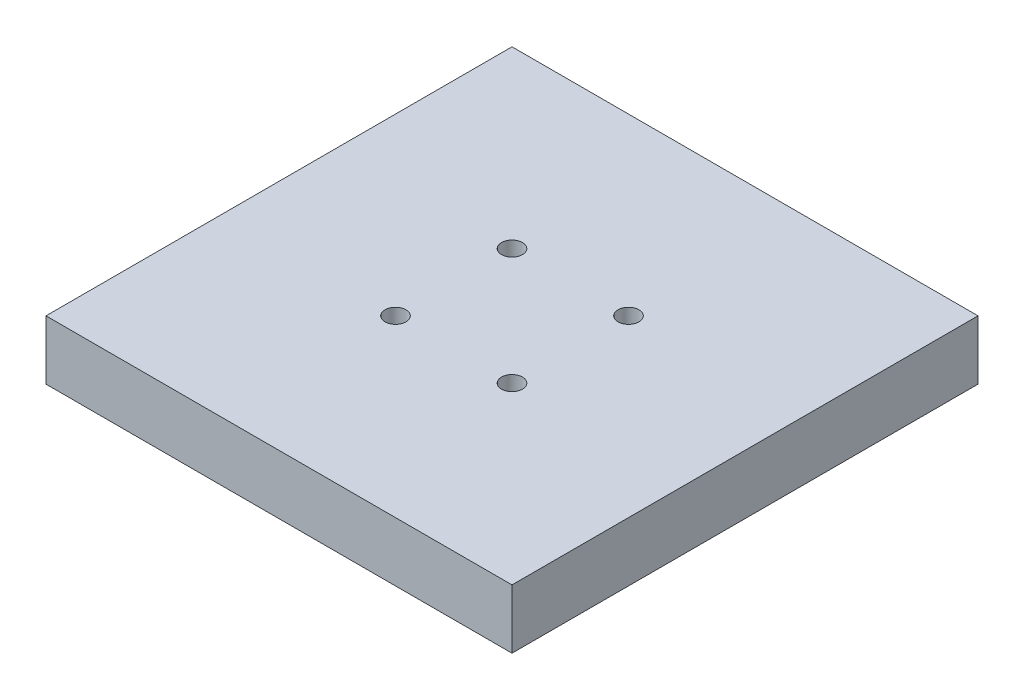
ISO-10303-21;
HEADER;
FILE_DESCRIPTION(('STEP AP214'),'2;1');
FILE_NAME('part.step','',(''),(''),'','','');
FILE_SCHEMA(('AUTOMOTIVE_DESIGN { 1 0 10303 214 1 1 1 1 }'));
ENDSEC;
DATA;
#1=APPLICATION_CONTEXT('core data for automotive mechanical design processes');
#2=APPLICATION_PROTOCOL_DEFINITION('international standard','automotive_design',2000,#1);
#3=PRODUCT_CONTEXT('',#1,'mechanical');
#4=PRODUCT('Part','Part','',(#3));
#5=PRODUCT_RELATED_PRODUCT_CATEGORY('part','',(#4));
#6=PRODUCT_DEFINITION_FORMATION('','',#4);
#7=PRODUCT_DEFINITION_CONTEXT('part definition',#1,'design');
#8=PRODUCT_DEFINITION('design','',#6,#7);
#9=PRODUCT_DEFINITION_SHAPE('','',#8);
#10=(LENGTH_UNIT() NAMED_UNIT(*) SI_UNIT(.MILLI.,.METRE.));
#11=(NAMED_UNIT(*) PLANE_ANGLE_UNIT() SI_UNIT($,.RADIAN.));
#12=(NAMED_UNIT(*) SI_UNIT($,.STERADIAN.) SOLID_ANGLE_UNIT());
#13=UNCERTAINTY_MEASURE_WITH_UNIT(LENGTH_MEASURE(1.E-05),#10,'distance_accuracy_value','');
#14=(GEOMETRIC_REPRESENTATION_CONTEXT(3) GLOBAL_UNCERTAINTY_ASSIGNED_CONTEXT((#13)) GLOBAL_UNIT_ASSIGNED_CONTEXT((#10,
#11,#12)) REPRESENTATION_CONTEXT('',''));
#15=CARTESIAN_POINT('',(0.,0.,0.));
#16=DIRECTION('',(0.,0.,1.));
#17=DIRECTION('',(1.,0.,0.));
#18=AXIS2_PLACEMENT_3D('',#15,#16,#17);
#19=CARTESIAN_POINT('',(-50.,12.7,50.));
#20=DIRECTION('',(1.,0.,0.));
#21=DIRECTION('',(0.,0.,-1.));
#22=AXIS2_PLACEMENT_3D('',#19,#20,#21);
#23=PLANE('',#22);
#24=DIRECTION('',(0.,0.,1.));
#25=VECTOR('',#24,1.);
#26=CARTESIAN_POINT('',(-50.,0.,50.));
#27=LINE('',#26,#25);
#28=CARTESIAN_POINT('',(-50.,0.,-50.));
#29=VERTEX_POINT('',#28);
#30=CARTESIAN_POINT('',(-50.,0.,50.));
#31=VERTEX_POINT('',#30);
#32=EDGE_CURVE('E97',#29,#31,#27,.T.);
#33=ORIENTED_EDGE('',*,*,#32,.T.);
#34=DIRECTION('',(0.,-1.,0.));
#35=VECTOR('',#34,1.);
#36=CARTESIAN_POINT('',(-50.,12.7,50.));
#37=LINE('',#36,#35);
#38=CARTESIAN_POINT('',(-50.,12.7,50.));
#39=VERTEX_POINT('',#38);
#40=EDGE_CURVE('E12',#39,#31,#37,.T.);
#41=ORIENTED_EDGE('',*,*,#40,.F.);
#42=DIRECTION('',(0.,0.,1.));
#43=VECTOR('',#42,1.);
#44=CARTESIAN_POINT('',(-50.,12.7,50.));
#45=LINE('',#44,#43);
#46=CARTESIAN_POINT('',(-50.,12.7,-50.));
#47=VERTEX_POINT('',#46);
#48=EDGE_CURVE('E85',#47,#39,#45,.T.);
#49=ORIENTED_EDGE('',*,*,#48,.F.);
#50=DIRECTION('',(0.,-1.,0.));
#51=VECTOR('',#50,1.);
#52=CARTESIAN_POINT('',(-50.,12.7,-50.));
#53=LINE('',#52,#51);
#54=EDGE_CURVE('E93',#47,#29,#53,.T.);
#55=ORIENTED_EDGE('',*,*,#54,.T.);
#56=EDGE_LOOP('',(#33,#41,#49,#55));
#57=FACE_BOUND('',#56,.T.);
#58=ADVANCED_FACE('F34',(#57),#23,.F.);
#59=CARTESIAN_POINT('',(50.,12.7,50.));
#60=DIRECTION('',(0.,0.,-1.));
#61=DIRECTION('',(-1.,0.,0.));
#62=AXIS2_PLACEMENT_3D('',#59,#60,#61);
#63=PLANE('',#62);
#64=DIRECTION('',(1.,0.,0.));
#65=VECTOR('',#64,1.);
#66=CARTESIAN_POINT('',(50.,0.,50.));
#67=LINE('',#66,#65);
#68=CARTESIAN_POINT('',(50.,0.,50.));
#69=VERTEX_POINT('',#68);
#70=EDGE_CURVE('E89',#31,#69,#67,.T.);
#71=ORIENTED_EDGE('',*,*,#70,.T.);
#72=DIRECTION('',(0.,-1.,0.));
#73=VECTOR('',#72,1.);
#74=CARTESIAN_POINT('',(50.,12.7,50.));
#75=LINE('',#74,#73);
#76=CARTESIAN_POINT('',(50.,12.7,50.));
#77=VERTEX_POINT('',#76);
#78=EDGE_CURVE('E42',#77,#69,#75,.T.);
#79=ORIENTED_EDGE('',*,*,#78,.F.);
#80=DIRECTION('',(1.,0.,0.));
#81=VECTOR('',#80,1.);
#82=CARTESIAN_POINT('',(50.,12.7,50.));
#83=LINE('',#82,#81);
#84=EDGE_CURVE('E80',#39,#77,#83,.T.);
#85=ORIENTED_EDGE('',*,*,#84,.F.);
#86=ORIENTED_EDGE('',*,*,#40,.T.);
#87=EDGE_LOOP('',(#71,#79,#85,#86));
#88=FACE_BOUND('',#87,.T.);
#89=ADVANCED_FACE('F88',(#88),#63,.F.);
#90=CARTESIAN_POINT('',(50.,12.7,50.));
#91=DIRECTION('',(-1.,0.,0.));
#92=DIRECTION('',(0.,0.,1.));
#93=AXIS2_PLACEMENT_3D('',#90,#91,#92);
#94=PLANE('',#93);
#95=DIRECTION('',(0.,0.,-1.));
#96=VECTOR('',#95,1.);
#97=CARTESIAN_POINT('',(50.,0.,50.));
#98=LINE('',#97,#96);
#99=CARTESIAN_POINT('',(50.,0.,-50.));
#100=VERTEX_POINT('',#99);
#101=EDGE_CURVE('E67',#69,#100,#98,.T.);
#102=ORIENTED_EDGE('',*,*,#101,.T.);
#103=DIRECTION('',(0.,-1.,0.));
#104=VECTOR('',#103,1.);
#105=CARTESIAN_POINT('',(50.,12.7,-50.));
#106=LINE('',#105,#104);
#107=CARTESIAN_POINT('',(50.,12.7,-50.));
#108=VERTEX_POINT('',#107);
#109=EDGE_CURVE('E90',#108,#100,#106,.T.);
#110=ORIENTED_EDGE('',*,*,#109,.F.);
#111=DIRECTION('',(0.,0.,-1.));
#112=VECTOR('',#111,1.);
#113=CARTESIAN_POINT('',(50.,12.7,50.));
#114=LINE('',#113,#112);
#115=EDGE_CURVE('E83',#77,#108,#114,.T.);
#116=ORIENTED_EDGE('',*,*,#115,.F.);
#117=ORIENTED_EDGE('',*,*,#78,.T.);
#118=EDGE_LOOP('',(#102,#110,#116,#117));
#119=FACE_BOUND('',#118,.T.);
#120=ADVANCED_FACE('F91',(#119),#94,.F.);
#121=CARTESIAN_POINT('',(50.,12.7,-50.));
#122=DIRECTION('',(0.,0.,1.));
#123=DIRECTION('',(1.,0.,0.));
#124=AXIS2_PLACEMENT_3D('',#121,#122,#123);
#125=PLANE('',#124);
#126=DIRECTION('',(-1.,0.,0.));
#127=VECTOR('',#126,1.);
#128=CARTESIAN_POINT('',(50.,0.,-50.));
#129=LINE('',#128,#127);
#130=EDGE_CURVE('E73',#100,#29,#129,.T.);
#131=ORIENTED_EDGE('',*,*,#130,.T.);
#132=ORIENTED_EDGE('',*,*,#54,.F.);
#133=DIRECTION('',(-1.,0.,0.));
#134=VECTOR('',#133,1.);
#135=CARTESIAN_POINT('',(50.,12.7,-50.));
#136=LINE('',#135,#134);
#137=EDGE_CURVE('E50',#108,#47,#136,.T.);
#138=ORIENTED_EDGE('',*,*,#137,.F.);
#139=ORIENTED_EDGE('',*,*,#109,.T.);
#140=EDGE_LOOP('',(#131,#132,#138,#139));
#141=FACE_BOUND('',#140,.T.);
#142=ADVANCED_FACE('F105',(#141),#125,.F.);
#143=CARTESIAN_POINT('',(0.,12.7,0.));
#144=DIRECTION('',(0.,1.,0.));
#145=DIRECTION('',(0.,0.,1.));
#146=AXIS2_PLACEMENT_3D('',#143,#144,#145);
#147=PLANE('',#146);
#148=CARTESIAN_POINT('',(12.5,12.7,12.5));
#149=DIRECTION('',(0.,-1.,0.));
#150=DIRECTION('',(0.,0.,-1.));
#151=AXIS2_PLACEMENT_3D('',#148,#149,#150);
#152=CIRCLE('',#151,2.25);
#153=CARTESIAN_POINT('',(12.5,12.7,10.25));
#154=VERTEX_POINT('',#153);
#155=EDGE_CURVE('E121',#154,#154,#152,.T.);
#156=ORIENTED_EDGE('',*,*,#155,.T.);
#157=EDGE_LOOP('',(#156));
#158=FACE_BOUND('',#157,.T.);
#159=CARTESIAN_POINT('',(-12.5,12.7,12.5));
#160=DIRECTION('',(0.,-1.,0.));
#161=DIRECTION('',(0.,0.,-1.));
#162=AXIS2_PLACEMENT_3D('',#159,#160,#161);
#163=CIRCLE('',#162,2.25000000000001);
#164=CARTESIAN_POINT('',(-12.5,12.7,10.25));
#165=VERTEX_POINT('',#164);
#166=EDGE_CURVE('E120',#165,#165,#163,.T.);
#167=ORIENTED_EDGE('',*,*,#166,.T.);
#168=EDGE_LOOP('',(#167));
#169=FACE_BOUND('',#168,.T.);
#170=CARTESIAN_POINT('',(12.5,12.7,-12.5));
#171=DIRECTION('',(0.,-1.,0.));
#172=DIRECTION('',(0.,0.,-1.));
#173=AXIS2_PLACEMENT_3D('',#170,#171,#172);
#174=CIRCLE('',#173,2.25);
#175=CARTESIAN_POINT('',(12.5,12.7,-14.75));
#176=VERTEX_POINT('',#175);
#177=EDGE_CURVE('E114',#176,#176,#174,.T.);
#178=ORIENTED_EDGE('',*,*,#177,.T.);
#179=EDGE_LOOP('',(#178));
#180=FACE_BOUND('',#179,.T.);
#181=CARTESIAN_POINT('',(-12.5,12.7,-12.5));
#182=DIRECTION('',(0.,-1.,0.));
#183=DIRECTION('',(0.,0.,-1.));
#184=AXIS2_PLACEMENT_3D('',#181,#182,#183);
#185=CIRCLE('',#184,2.25000000000001);
#186=CARTESIAN_POINT('',(-12.5,12.7,-14.75));
#187=VERTEX_POINT('',#186);
#188=EDGE_CURVE('E100',#187,#187,#185,.T.);
#189=ORIENTED_EDGE('',*,*,#188,.T.);
#190=EDGE_LOOP('',(#189));
#191=FACE_BOUND('',#190,.T.);
#192=ORIENTED_EDGE('',*,*,#48,.T.);
#193=ORIENTED_EDGE('',*,*,#84,.T.);
#194=ORIENTED_EDGE('',*,*,#115,.T.);
#195=ORIENTED_EDGE('',*,*,#137,.T.);
#196=EDGE_LOOP('',(#192,#193,#194,#195));
#197=FACE_BOUND('',#196,.T.);
#198=ADVANCED_FACE('F81',(#158,#169,#180,#191,#197),#147,.T.);
#199=CARTESIAN_POINT('',(0.,0.,0.));
#200=DIRECTION('',(0.,1.,0.));
#201=DIRECTION('',(0.,0.,1.));
#202=AXIS2_PLACEMENT_3D('',#199,#200,#201);
#203=PLANE('',#202);
#204=CARTESIAN_POINT('',(12.5,0.,12.5));
#205=DIRECTION('',(0.,-1.,0.));
#206=DIRECTION('',(0.,0.,-1.));
#207=AXIS2_PLACEMENT_3D('',#204,#205,#206);
#208=CIRCLE('',#207,2.25);
#209=CARTESIAN_POINT('',(12.5,0.,10.25));
#210=VERTEX_POINT('',#209);
#211=EDGE_CURVE('E129',#210,#210,#208,.T.);
#212=ORIENTED_EDGE('',*,*,#211,.F.);
#213=EDGE_LOOP('',(#212));
#214=FACE_BOUND('',#213,.T.);
#215=CARTESIAN_POINT('',(-12.5,0.,12.5));
#216=DIRECTION('',(0.,-1.,0.));
#217=DIRECTION('',(0.,0.,-1.));
#218=AXIS2_PLACEMENT_3D('',#215,#216,#217);
#219=CIRCLE('',#218,2.25000000000001);
#220=CARTESIAN_POINT('',(-12.5,0.,10.25));
#221=VERTEX_POINT('',#220);
#222=EDGE_CURVE('E117',#221,#221,#219,.T.);
#223=ORIENTED_EDGE('',*,*,#222,.F.);
#224=EDGE_LOOP('',(#223));
#225=FACE_BOUND('',#224,.T.);
#226=CARTESIAN_POINT('',(12.5,0.,-12.5));
#227=DIRECTION('',(0.,-1.,0.));
#228=DIRECTION('',(0.,0.,-1.));
#229=AXIS2_PLACEMENT_3D('',#226,#227,#228);
#230=CIRCLE('',#229,2.25);
#231=CARTESIAN_POINT('',(12.5,0.,-14.75));
#232=VERTEX_POINT('',#231);
#233=EDGE_CURVE('E124',#232,#232,#230,.T.);
#234=ORIENTED_EDGE('',*,*,#233,.F.);
#235=EDGE_LOOP('',(#234));
#236=FACE_BOUND('',#235,.T.);
#237=CARTESIAN_POINT('',(-12.5,0.,-12.5));
#238=DIRECTION('',(0.,-1.,0.));
#239=DIRECTION('',(0.,0.,-1.));
#240=AXIS2_PLACEMENT_3D('',#237,#238,#239);
#241=CIRCLE('',#240,2.25000000000001);
#242=CARTESIAN_POINT('',(-12.5,0.,-14.75));
#243=VERTEX_POINT('',#242);
#244=EDGE_CURVE('E111',#243,#243,#241,.T.);
#245=ORIENTED_EDGE('',*,*,#244,.F.);
#246=EDGE_LOOP('',(#245));
#247=FACE_BOUND('',#246,.T.);
#248=ORIENTED_EDGE('',*,*,#32,.F.);
#249=ORIENTED_EDGE('',*,*,#130,.F.);
#250=ORIENTED_EDGE('',*,*,#101,.F.);
#251=ORIENTED_EDGE('',*,*,#70,.F.);
#252=EDGE_LOOP('',(#248,#249,#250,#251));
#253=FACE_BOUND('',#252,.T.);
#254=ADVANCED_FACE('F108',(#214,#225,#236,#247,#253),#203,.F.);
#255=CARTESIAN_POINT('',(-12.5,12.7,-12.5));
#256=DIRECTION('',(0.,-1.,0.));
#257=DIRECTION('',(0.,0.,-1.));
#258=AXIS2_PLACEMENT_3D('',#255,#256,#257);
#259=CYLINDRICAL_SURFACE('',#258,2.25000000000001);
#260=ORIENTED_EDGE('',*,*,#188,.F.);
#261=EDGE_LOOP('',(#260));
#262=FACE_BOUND('',#261,.T.);
#263=ORIENTED_EDGE('',*,*,#244,.T.);
#264=EDGE_LOOP('',(#263));
#265=FACE_BOUND('',#264,.T.);
#266=ADVANCED_FACE('F146',(#262,#265),#259,.F.);
#267=CARTESIAN_POINT('',(12.5,12.7,-12.5));
#268=DIRECTION('',(0.,-1.,0.));
#269=DIRECTION('',(0.,0.,-1.));
#270=AXIS2_PLACEMENT_3D('',#267,#268,#269);
#271=CYLINDRICAL_SURFACE('',#270,2.25);
#272=ORIENTED_EDGE('',*,*,#177,.F.);
#273=EDGE_LOOP('',(#272));
#274=FACE_BOUND('',#273,.T.);
#275=ORIENTED_EDGE('',*,*,#233,.T.);
#276=EDGE_LOOP('',(#275));
#277=FACE_BOUND('',#276,.T.);
#278=ADVANCED_FACE('F155',(#274,#277),#271,.F.);
#279=CARTESIAN_POINT('',(-12.5,12.7,12.5));
#280=DIRECTION('',(0.,-1.,0.));
#281=DIRECTION('',(0.,0.,-1.));
#282=AXIS2_PLACEMENT_3D('',#279,#280,#281);
#283=CYLINDRICAL_SURFACE('',#282,2.25000000000001);
#284=ORIENTED_EDGE('',*,*,#166,.F.);
#285=EDGE_LOOP('',(#284));
#286=FACE_BOUND('',#285,.T.);
#287=ORIENTED_EDGE('',*,*,#222,.T.);
#288=EDGE_LOOP('',(#287));
#289=FACE_BOUND('',#288,.T.);
#290=ADVANCED_FACE('F140',(#286,#289),#283,.F.);
#291=CARTESIAN_POINT('',(12.5,12.7,12.5));
#292=DIRECTION('',(0.,-1.,0.));
#293=DIRECTION('',(0.,0.,-1.));
#294=AXIS2_PLACEMENT_3D('',#291,#292,#293);
#295=CYLINDRICAL_SURFACE('',#294,2.25);
#296=ORIENTED_EDGE('',*,*,#155,.F.);
#297=EDGE_LOOP('',(#296));
#298=FACE_BOUND('',#297,.T.);
#299=ORIENTED_EDGE('',*,*,#211,.T.);
#300=EDGE_LOOP('',(#299));
#301=FACE_BOUND('',#300,.T.);
#302=ADVANCED_FACE('F137',(#298,#301),#295,.F.);
#303=CLOSED_SHELL('',(#58,#89,#120,#142,#198,#254,#266,#278,#290,#302));
#304=MANIFOLD_SOLID_BREP('B2',#303);
#305=ADVANCED_BREP_SHAPE_REPRESENTATION('',(#18,#304),#14);
#306=SHAPE_DEFINITION_REPRESENTATION(#9,#305);
ENDSEC;
END-ISO-10303-21;
